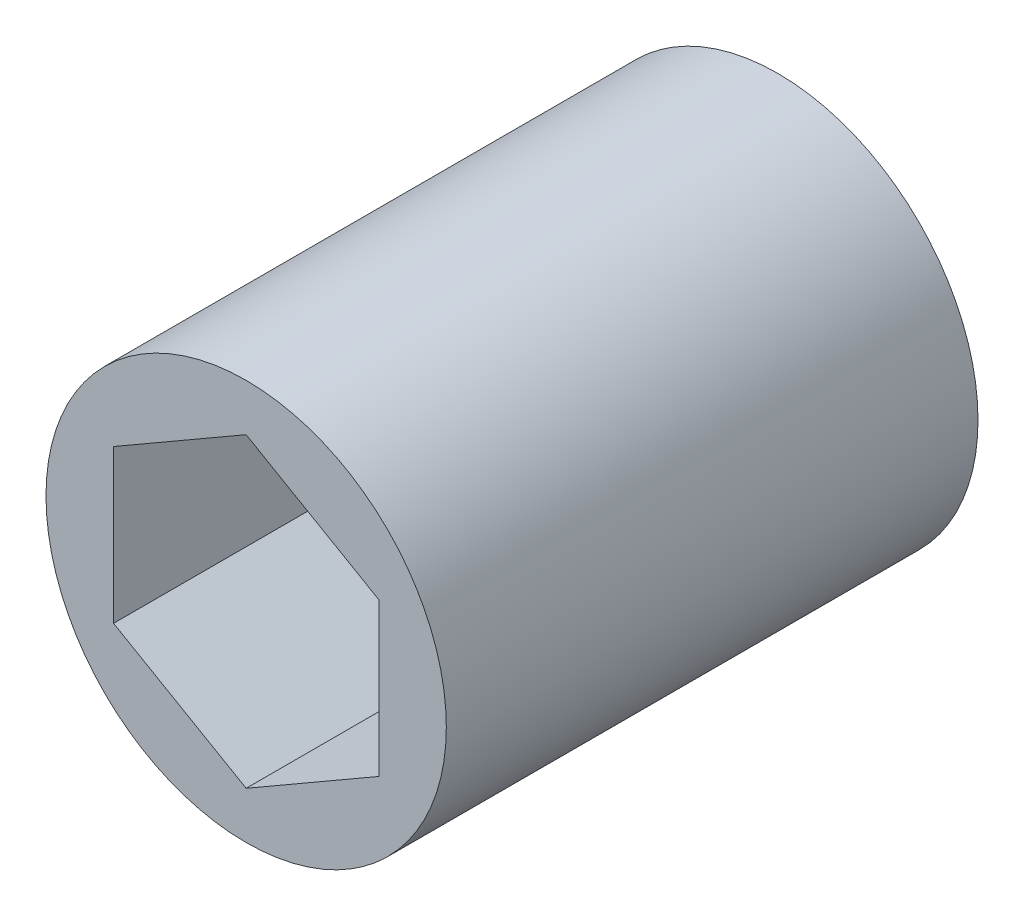
ISO-10303-21;
HEADER;
FILE_DESCRIPTION(('STEP AP214'),'2;1');
FILE_NAME('part.step','',(''),(''),'','','');
FILE_SCHEMA(('AUTOMOTIVE_DESIGN { 1 0 10303 214 1 1 1 1 }'));
ENDSEC;
DATA;
#1=APPLICATION_CONTEXT('core data for automotive mechanical design processes');
#2=APPLICATION_PROTOCOL_DEFINITION('international standard','automotive_design',2000,#1);
#3=PRODUCT_CONTEXT('',#1,'mechanical');
#4=PRODUCT('Part','Part','',(#3));
#5=PRODUCT_RELATED_PRODUCT_CATEGORY('part','',(#4));
#6=PRODUCT_DEFINITION_FORMATION('','',#4);
#7=PRODUCT_DEFINITION_CONTEXT('part definition',#1,'design');
#8=PRODUCT_DEFINITION('design','',#6,#7);
#9=PRODUCT_DEFINITION_SHAPE('','',#8);
#10=(LENGTH_UNIT() NAMED_UNIT(*) SI_UNIT(.MILLI.,.METRE.));
#11=(NAMED_UNIT(*) PLANE_ANGLE_UNIT() SI_UNIT($,.RADIAN.));
#12=(NAMED_UNIT(*) SI_UNIT($,.STERADIAN.) SOLID_ANGLE_UNIT());
#13=UNCERTAINTY_MEASURE_WITH_UNIT(LENGTH_MEASURE(1.E-05),#10,'distance_accuracy_value','');
#14=(GEOMETRIC_REPRESENTATION_CONTEXT(3) GLOBAL_UNCERTAINTY_ASSIGNED_CONTEXT((#13)) GLOBAL_UNIT_ASSIGNED_CONTEXT((#10,
#11,#12)) REPRESENTATION_CONTEXT('',''));
#15=CARTESIAN_POINT('',(0.,0.,0.));
#16=DIRECTION('',(0.,0.,1.));
#17=DIRECTION('',(1.,0.,0.));
#18=AXIS2_PLACEMENT_3D('',#15,#16,#17);
#19=CARTESIAN_POINT('',(0.,0.,26.9875));
#20=DIRECTION('',(0.,0.,1.));
#21=DIRECTION('',(1.,0.,0.));
#22=AXIS2_PLACEMENT_3D('',#19,#20,#21);
#23=PLANE('',#22);
#24=CARTESIAN_POINT('',(0.,0.,26.9875));
#25=DIRECTION('',(0.,0.,1.));
#26=DIRECTION('',(1.,0.,0.));
#27=AXIS2_PLACEMENT_3D('',#24,#25,#26);
#28=CIRCLE('',#27,10.16);
#29=CARTESIAN_POINT('',(10.16,0.,26.9875));
#30=VERTEX_POINT('',#29);
#31=EDGE_CURVE('E11',#30,#30,#28,.T.);
#32=ORIENTED_EDGE('',*,*,#31,.T.);
#33=EDGE_LOOP('',(#32));
#34=FACE_BOUND('',#33,.T.);
#35=DIRECTION('',(-0.866025403784439,0.5,0.));
#36=VECTOR('',#35,1.);
#37=CARTESIAN_POINT('',(6.731,3.88614466191537,26.9875));
#38=LINE('',#37,#36);
#39=CARTESIAN_POINT('',(6.731,3.88614466191537,26.9875));
#40=VERTEX_POINT('',#39);
#41=CARTESIAN_POINT('',(0.,7.77228932383074,26.9875));
#42=VERTEX_POINT('',#41);
#43=EDGE_CURVE('E110',#40,#42,#38,.T.);
#44=ORIENTED_EDGE('',*,*,#43,.F.);
#45=DIRECTION('',(0.,1.,0.));
#46=VECTOR('',#45,1.);
#47=CARTESIAN_POINT('',(6.731,-3.88614466191537,26.9875));
#48=LINE('',#47,#46);
#49=CARTESIAN_POINT('',(6.731,-3.88614466191537,26.9875));
#50=VERTEX_POINT('',#49);
#51=EDGE_CURVE('E101',#50,#40,#48,.T.);
#52=ORIENTED_EDGE('',*,*,#51,.F.);
#53=DIRECTION('',(0.866025403784439,0.5,0.));
#54=VECTOR('',#53,1.);
#55=CARTESIAN_POINT('',(0.,-7.77228932383074,26.9875));
#56=LINE('',#55,#54);
#57=CARTESIAN_POINT('',(0.,-7.77228932383074,26.9875));
#58=VERTEX_POINT('',#57);
#59=EDGE_CURVE('E135',#58,#50,#56,.T.);
#60=ORIENTED_EDGE('',*,*,#59,.F.);
#61=DIRECTION('',(0.866025403784439,-0.5,0.));
#62=VECTOR('',#61,1.);
#63=CARTESIAN_POINT('',(-6.731,-3.88614466191537,26.9875));
#64=LINE('',#63,#62);
#65=CARTESIAN_POINT('',(-6.731,-3.88614466191537,26.9875));
#66=VERTEX_POINT('',#65);
#67=EDGE_CURVE('E132',#66,#58,#64,.T.);
#68=ORIENTED_EDGE('',*,*,#67,.F.);
#69=DIRECTION('',(0.,-1.,0.));
#70=VECTOR('',#69,1.);
#71=CARTESIAN_POINT('',(-6.731,3.88614466191537,26.9875));
#72=LINE('',#71,#70);
#73=CARTESIAN_POINT('',(-6.731,3.88614466191537,26.9875));
#74=VERTEX_POINT('',#73);
#75=EDGE_CURVE('E127',#74,#66,#72,.T.);
#76=ORIENTED_EDGE('',*,*,#75,.F.);
#77=DIRECTION('',(-0.866025403784439,-0.5,0.));
#78=VECTOR('',#77,1.);
#79=CARTESIAN_POINT('',(0.,7.77228932383074,26.9875));
#80=LINE('',#79,#78);
#81=EDGE_CURVE('E123',#42,#74,#80,.T.);
#82=ORIENTED_EDGE('',*,*,#81,.F.);
#83=EDGE_LOOP('',(#44,#52,#60,#68,#76,#82));
#84=FACE_BOUND('',#83,.T.);
#85=ADVANCED_FACE('F47',(#34,#84),#23,.T.);
#86=CARTESIAN_POINT('',(0.,0.,0.));
#87=DIRECTION('',(0.,0.,1.));
#88=DIRECTION('',(1.,0.,0.));
#89=AXIS2_PLACEMENT_3D('',#86,#87,#88);
#90=PLANE('',#89);
#91=CARTESIAN_POINT('',(0.,0.,0.));
#92=DIRECTION('',(0.,0.,1.));
#93=DIRECTION('',(1.,0.,0.));
#94=AXIS2_PLACEMENT_3D('',#91,#92,#93);
#95=CIRCLE('',#94,10.16);
#96=CARTESIAN_POINT('',(10.16,0.,0.));
#97=VERTEX_POINT('',#96);
#98=EDGE_CURVE('E51',#97,#97,#95,.T.);
#99=ORIENTED_EDGE('',*,*,#98,.F.);
#100=EDGE_LOOP('',(#99));
#101=FACE_BOUND('',#100,.T.);
#102=DIRECTION('',(0.,1.,0.));
#103=VECTOR('',#102,1.);
#104=CARTESIAN_POINT('',(6.731,-3.88614466191537,0.));
#105=LINE('',#104,#103);
#106=CARTESIAN_POINT('',(6.731,-3.88614466191537,0.));
#107=VERTEX_POINT('',#106);
#108=CARTESIAN_POINT('',(6.731,3.88614466191537,0.));
#109=VERTEX_POINT('',#108);
#110=EDGE_CURVE('E71',#107,#109,#105,.T.);
#111=ORIENTED_EDGE('',*,*,#110,.T.);
#112=DIRECTION('',(-0.866025403784439,0.5,0.));
#113=VECTOR('',#112,1.);
#114=CARTESIAN_POINT('',(6.731,3.88614466191537,0.));
#115=LINE('',#114,#113);
#116=CARTESIAN_POINT('',(0.,7.77228932383074,0.));
#117=VERTEX_POINT('',#116);
#118=EDGE_CURVE('E117',#109,#117,#115,.T.);
#119=ORIENTED_EDGE('',*,*,#118,.T.);
#120=DIRECTION('',(-0.866025403784439,-0.5,0.));
#121=VECTOR('',#120,1.);
#122=CARTESIAN_POINT('',(0.,7.77228932383074,0.));
#123=LINE('',#122,#121);
#124=CARTESIAN_POINT('',(-6.731,3.88614466191537,0.));
#125=VERTEX_POINT('',#124);
#126=EDGE_CURVE('E142',#117,#125,#123,.T.);
#127=ORIENTED_EDGE('',*,*,#126,.T.);
#128=DIRECTION('',(0.,-1.,0.));
#129=VECTOR('',#128,1.);
#130=CARTESIAN_POINT('',(-6.731,3.88614466191537,0.));
#131=LINE('',#130,#129);
#132=CARTESIAN_POINT('',(-6.731,-3.88614466191537,0.));
#133=VERTEX_POINT('',#132);
#134=EDGE_CURVE('E146',#125,#133,#131,.T.);
#135=ORIENTED_EDGE('',*,*,#134,.T.);
#136=DIRECTION('',(0.866025403784439,-0.5,0.));
#137=VECTOR('',#136,1.);
#138=CARTESIAN_POINT('',(-6.731,-3.88614466191537,0.));
#139=LINE('',#138,#137);
#140=CARTESIAN_POINT('',(0.,-7.77228932383074,0.));
#141=VERTEX_POINT('',#140);
#142=EDGE_CURVE('E150',#133,#141,#139,.T.);
#143=ORIENTED_EDGE('',*,*,#142,.T.);
#144=DIRECTION('',(0.866025403784439,0.5,0.));
#145=VECTOR('',#144,1.);
#146=CARTESIAN_POINT('',(0.,-7.77228932383074,0.));
#147=LINE('',#146,#145);
#148=EDGE_CURVE('E111',#141,#107,#147,.T.);
#149=ORIENTED_EDGE('',*,*,#148,.T.);
#150=EDGE_LOOP('',(#111,#119,#127,#135,#143,#149));
#151=FACE_BOUND('',#150,.T.);
#152=ADVANCED_FACE('F174',(#101,#151),#90,.F.);
#153=CARTESIAN_POINT('',(0.,0.,26.9875));
#154=DIRECTION('',(0.,0.,-1.));
#155=DIRECTION('',(-1.,0.,0.));
#156=AXIS2_PLACEMENT_3D('',#153,#154,#155);
#157=CYLINDRICAL_SURFACE('',#156,10.16);
#158=ORIENTED_EDGE('',*,*,#31,.F.);
#159=EDGE_LOOP('',(#158));
#160=FACE_BOUND('',#159,.T.);
#161=ORIENTED_EDGE('',*,*,#98,.T.);
#162=EDGE_LOOP('',(#161));
#163=FACE_BOUND('',#162,.T.);
#164=ADVANCED_FACE('F49',(#160,#163),#157,.T.);
#165=CARTESIAN_POINT('',(6.731,-3.88614466191537,26.9875));
#166=DIRECTION('',(-1.,0.,0.));
#167=DIRECTION('',(0.,-1.,0.));
#168=AXIS2_PLACEMENT_3D('',#165,#166,#167);
#169=PLANE('',#168);
#170=ORIENTED_EDGE('',*,*,#110,.F.);
#171=DIRECTION('',(0.,0.,-1.));
#172=VECTOR('',#171,1.);
#173=CARTESIAN_POINT('',(6.731,-3.88614466191537,26.9875));
#174=LINE('',#173,#172);
#175=EDGE_CURVE('E105',#50,#107,#174,.T.);
#176=ORIENTED_EDGE('',*,*,#175,.F.);
#177=ORIENTED_EDGE('',*,*,#51,.T.);
#178=DIRECTION('',(0.,0.,-1.));
#179=VECTOR('',#178,1.);
#180=CARTESIAN_POINT('',(6.731,3.88614466191537,26.9875));
#181=LINE('',#180,#179);
#182=EDGE_CURVE('E104',#40,#109,#181,.T.);
#183=ORIENTED_EDGE('',*,*,#182,.T.);
#184=EDGE_LOOP('',(#170,#176,#177,#183));
#185=FACE_BOUND('',#184,.T.);
#186=ADVANCED_FACE('F103',(#185),#169,.T.);
#187=CARTESIAN_POINT('',(6.731,3.88614466191537,26.9875));
#188=DIRECTION('',(-0.5,-0.866025403784439,0.));
#189=DIRECTION('',(0.866025403784439,-0.5,0.));
#190=AXIS2_PLACEMENT_3D('',#187,#188,#189);
#191=PLANE('',#190);
#192=ORIENTED_EDGE('',*,*,#118,.F.);
#193=ORIENTED_EDGE('',*,*,#182,.F.);
#194=ORIENTED_EDGE('',*,*,#43,.T.);
#195=DIRECTION('',(0.,0.,-1.));
#196=VECTOR('',#195,1.);
#197=CARTESIAN_POINT('',(0.,7.77228932383074,26.9875));
#198=LINE('',#197,#196);
#199=EDGE_CURVE('E119',#42,#117,#198,.T.);
#200=ORIENTED_EDGE('',*,*,#199,.T.);
#201=EDGE_LOOP('',(#192,#193,#194,#200));
#202=FACE_BOUND('',#201,.T.);
#203=ADVANCED_FACE('F114',(#202),#191,.T.);
#204=CARTESIAN_POINT('',(0.,7.77228932383074,26.9875));
#205=DIRECTION('',(0.5,-0.866025403784439,0.));
#206=DIRECTION('',(0.866025403784439,0.5,0.));
#207=AXIS2_PLACEMENT_3D('',#204,#205,#206);
#208=PLANE('',#207);
#209=ORIENTED_EDGE('',*,*,#126,.F.);
#210=ORIENTED_EDGE('',*,*,#199,.F.);
#211=ORIENTED_EDGE('',*,*,#81,.T.);
#212=DIRECTION('',(0.,0.,-1.));
#213=VECTOR('',#212,1.);
#214=CARTESIAN_POINT('',(-6.731,3.88614466191537,26.9875));
#215=LINE('',#214,#213);
#216=EDGE_CURVE('E164',#74,#125,#215,.T.);
#217=ORIENTED_EDGE('',*,*,#216,.T.);
#218=EDGE_LOOP('',(#209,#210,#211,#217));
#219=FACE_BOUND('',#218,.T.);
#220=ADVANCED_FACE('F170',(#219),#208,.T.);
#221=CARTESIAN_POINT('',(-6.731,3.88614466191537,26.9875));
#222=DIRECTION('',(1.,0.,0.));
#223=DIRECTION('',(0.,1.,0.));
#224=AXIS2_PLACEMENT_3D('',#221,#222,#223);
#225=PLANE('',#224);
#226=ORIENTED_EDGE('',*,*,#134,.F.);
#227=ORIENTED_EDGE('',*,*,#216,.F.);
#228=ORIENTED_EDGE('',*,*,#75,.T.);
#229=DIRECTION('',(0.,0.,-1.));
#230=VECTOR('',#229,1.);
#231=CARTESIAN_POINT('',(-6.731,-3.88614466191537,26.9875));
#232=LINE('',#231,#230);
#233=EDGE_CURVE('E161',#66,#133,#232,.T.);
#234=ORIENTED_EDGE('',*,*,#233,.T.);
#235=EDGE_LOOP('',(#226,#227,#228,#234));
#236=FACE_BOUND('',#235,.T.);
#237=ADVANCED_FACE('F182',(#236),#225,.T.);
#238=CARTESIAN_POINT('',(-6.731,-3.88614466191537,26.9875));
#239=DIRECTION('',(0.5,0.866025403784439,0.));
#240=DIRECTION('',(-0.866025403784439,0.5,0.));
#241=AXIS2_PLACEMENT_3D('',#238,#239,#240);
#242=PLANE('',#241);
#243=ORIENTED_EDGE('',*,*,#142,.F.);
#244=ORIENTED_EDGE('',*,*,#233,.F.);
#245=ORIENTED_EDGE('',*,*,#67,.T.);
#246=DIRECTION('',(0.,0.,-1.));
#247=VECTOR('',#246,1.);
#248=CARTESIAN_POINT('',(0.,-7.77228932383074,26.9875));
#249=LINE('',#248,#247);
#250=EDGE_CURVE('E63',#58,#141,#249,.T.);
#251=ORIENTED_EDGE('',*,*,#250,.T.);
#252=EDGE_LOOP('',(#243,#244,#245,#251));
#253=FACE_BOUND('',#252,.T.);
#254=ADVANCED_FACE('F180',(#253),#242,.T.);
#255=CARTESIAN_POINT('',(0.,-7.77228932383074,26.9875));
#256=DIRECTION('',(-0.5,0.866025403784439,0.));
#257=DIRECTION('',(-0.866025403784439,-0.5,0.));
#258=AXIS2_PLACEMENT_3D('',#255,#256,#257);
#259=PLANE('',#258);
#260=ORIENTED_EDGE('',*,*,#148,.F.);
#261=ORIENTED_EDGE('',*,*,#250,.F.);
#262=ORIENTED_EDGE('',*,*,#59,.T.);
#263=ORIENTED_EDGE('',*,*,#175,.T.);
#264=EDGE_LOOP('',(#260,#261,#262,#263));
#265=FACE_BOUND('',#264,.T.);
#266=ADVANCED_FACE('F176',(#265),#259,.T.);
#267=CLOSED_SHELL('',(#85,#152,#164,#186,#203,#220,#237,#254,#266));
#268=MANIFOLD_SOLID_BREP('B2',#267);
#269=ADVANCED_BREP_SHAPE_REPRESENTATION('',(#18,#268),#14);
#270=SHAPE_DEFINITION_REPRESENTATION(#9,#269);
ENDSEC;
END-ISO-10303-21;
